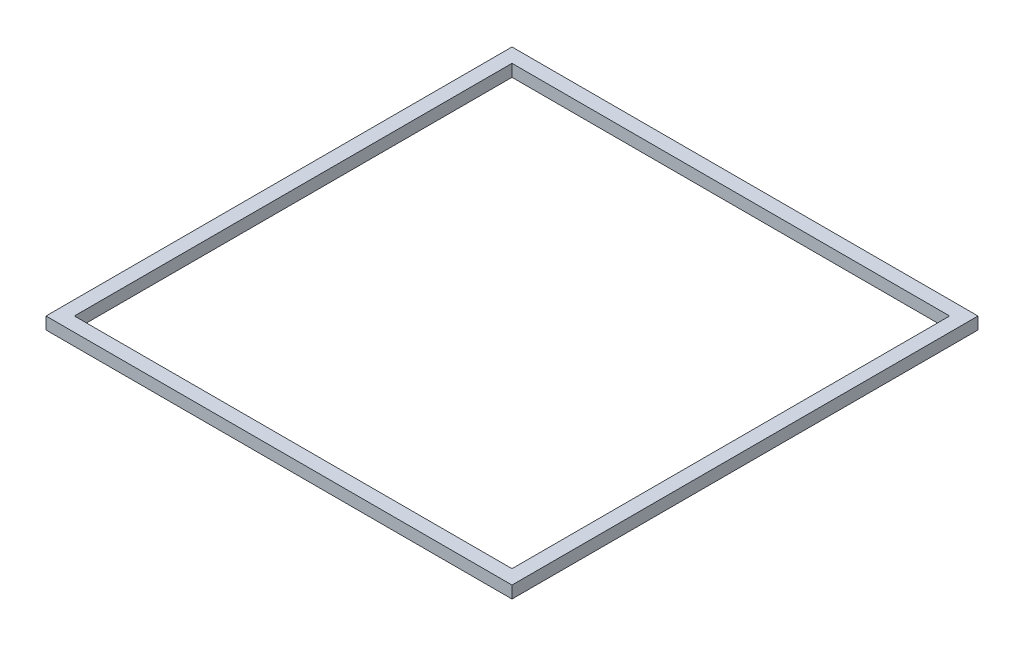
ISO-10303-21;
HEADER;
FILE_DESCRIPTION(('STEP AP214'),'2;1');
FILE_NAME('part.step','',(''),(''),'','','');
FILE_SCHEMA(('AUTOMOTIVE_DESIGN { 1 0 10303 214 1 1 1 1 }'));
ENDSEC;
DATA;
#1=APPLICATION_CONTEXT('core data for automotive mechanical design processes');
#2=APPLICATION_PROTOCOL_DEFINITION('international standard','automotive_design',2000,#1);
#3=PRODUCT_CONTEXT('',#1,'mechanical');
#4=PRODUCT('Part','Part','',(#3));
#5=PRODUCT_RELATED_PRODUCT_CATEGORY('part','',(#4));
#6=PRODUCT_DEFINITION_FORMATION('','',#4);
#7=PRODUCT_DEFINITION_CONTEXT('part definition',#1,'design');
#8=PRODUCT_DEFINITION('design','',#6,#7);
#9=PRODUCT_DEFINITION_SHAPE('','',#8);
#10=(LENGTH_UNIT() NAMED_UNIT(*) SI_UNIT(.MILLI.,.METRE.));
#11=(NAMED_UNIT(*) PLANE_ANGLE_UNIT() SI_UNIT($,.RADIAN.));
#12=(NAMED_UNIT(*) SI_UNIT($,.STERADIAN.) SOLID_ANGLE_UNIT());
#13=UNCERTAINTY_MEASURE_WITH_UNIT(LENGTH_MEASURE(1.E-05),#10,'distance_accuracy_value','');
#14=(GEOMETRIC_REPRESENTATION_CONTEXT(3) GLOBAL_UNCERTAINTY_ASSIGNED_CONTEXT((#13)) GLOBAL_UNIT_ASSIGNED_CONTEXT((#10,
#11,#12)) REPRESENTATION_CONTEXT('',''));
#15=CARTESIAN_POINT('',(0.,0.,0.));
#16=DIRECTION('',(0.,0.,1.));
#17=DIRECTION('',(1.,0.,0.));
#18=AXIS2_PLACEMENT_3D('',#15,#16,#17);
#19=CARTESIAN_POINT('',(0.,3.,0.));
#20=DIRECTION('',(0.,-1.,0.));
#21=DIRECTION('',(0.,0.,-1.));
#22=AXIS2_PLACEMENT_3D('',#19,#20,#21);
#23=PLANE('',#22);
#24=DIRECTION('',(0.,0.,-1.));
#25=VECTOR('',#24,1.);
#26=CARTESIAN_POINT('',(57.5,3.,57.5));
#27=LINE('',#26,#25);
#28=CARTESIAN_POINT('',(57.5,3.,57.5));
#29=VERTEX_POINT('',#28);
#30=CARTESIAN_POINT('',(57.5,3.,-57.5));
#31=VERTEX_POINT('',#30);
#32=EDGE_CURVE('E137',#29,#31,#27,.T.);
#33=ORIENTED_EDGE('',*,*,#32,.T.);
#34=DIRECTION('',(-1.,0.,0.));
#35=VECTOR('',#34,1.);
#36=CARTESIAN_POINT('',(-57.5,3.,-57.5));
#37=LINE('',#36,#35);
#38=CARTESIAN_POINT('',(-57.5,3.,-57.5));
#39=VERTEX_POINT('',#38);
#40=EDGE_CURVE('E140',#31,#39,#37,.T.);
#41=ORIENTED_EDGE('',*,*,#40,.T.);
#42=DIRECTION('',(0.,0.,1.));
#43=VECTOR('',#42,1.);
#44=CARTESIAN_POINT('',(-57.5,3.,57.5));
#45=LINE('',#44,#43);
#46=CARTESIAN_POINT('',(-57.5,3.,57.5));
#47=VERTEX_POINT('',#46);
#48=EDGE_CURVE('E143',#39,#47,#45,.T.);
#49=ORIENTED_EDGE('',*,*,#48,.T.);
#50=DIRECTION('',(1.,0.,0.));
#51=VECTOR('',#50,1.);
#52=CARTESIAN_POINT('',(-57.5,3.,57.5));
#53=LINE('',#52,#51);
#54=EDGE_CURVE('E145',#47,#29,#53,.T.);
#55=ORIENTED_EDGE('',*,*,#54,.T.);
#56=EDGE_LOOP('',(#33,#41,#49,#55));
#57=FACE_BOUND('',#56,.T.);
#58=DIRECTION('',(0.,0.,-1.));
#59=VECTOR('',#58,1.);
#60=CARTESIAN_POINT('',(54.,3.,54.));
#61=LINE('',#60,#59);
#62=CARTESIAN_POINT('',(54.,3.,54.));
#63=VERTEX_POINT('',#62);
#64=CARTESIAN_POINT('',(54.,3.,-54.));
#65=VERTEX_POINT('',#64);
#66=EDGE_CURVE('E101',#63,#65,#61,.T.);
#67=ORIENTED_EDGE('',*,*,#66,.F.);
#68=DIRECTION('',(1.,0.,0.));
#69=VECTOR('',#68,1.);
#70=CARTESIAN_POINT('',(-54.,3.,54.));
#71=LINE('',#70,#69);
#72=CARTESIAN_POINT('',(-54.,3.,54.));
#73=VERTEX_POINT('',#72);
#74=EDGE_CURVE('E123',#73,#63,#71,.T.);
#75=ORIENTED_EDGE('',*,*,#74,.F.);
#76=DIRECTION('',(0.,0.,1.));
#77=VECTOR('',#76,1.);
#78=CARTESIAN_POINT('',(-54.,3.,54.));
#79=LINE('',#78,#77);
#80=CARTESIAN_POINT('',(-54.,3.,-54.));
#81=VERTEX_POINT('',#80);
#82=EDGE_CURVE('E121',#81,#73,#79,.T.);
#83=ORIENTED_EDGE('',*,*,#82,.F.);
#84=DIRECTION('',(-1.,0.,0.));
#85=VECTOR('',#84,1.);
#86=CARTESIAN_POINT('',(-54.,3.,-54.));
#87=LINE('',#86,#85);
#88=EDGE_CURVE('E109',#65,#81,#87,.T.);
#89=ORIENTED_EDGE('',*,*,#88,.F.);
#90=EDGE_LOOP('',(#67,#75,#83,#89));
#91=FACE_BOUND('',#90,.T.);
#92=ADVANCED_FACE('F36',(#57,#91),#23,.F.);
#93=CARTESIAN_POINT('',(0.,0.,0.));
#94=DIRECTION('',(0.,-1.,0.));
#95=DIRECTION('',(0.,0.,-1.));
#96=AXIS2_PLACEMENT_3D('',#93,#94,#95);
#97=PLANE('',#96);
#98=DIRECTION('',(0.,0.,-1.));
#99=VECTOR('',#98,1.);
#100=CARTESIAN_POINT('',(57.5,0.,57.5));
#101=LINE('',#100,#99);
#102=CARTESIAN_POINT('',(57.5,0.,57.5));
#103=VERTEX_POINT('',#102);
#104=CARTESIAN_POINT('',(57.5,0.,-57.5));
#105=VERTEX_POINT('',#104);
#106=EDGE_CURVE('E117',#103,#105,#101,.T.);
#107=ORIENTED_EDGE('',*,*,#106,.F.);
#108=DIRECTION('',(1.,0.,0.));
#109=VECTOR('',#108,1.);
#110=CARTESIAN_POINT('',(-57.5,0.,57.5));
#111=LINE('',#110,#109);
#112=CARTESIAN_POINT('',(-57.5,0.,57.5));
#113=VERTEX_POINT('',#112);
#114=EDGE_CURVE('E141',#113,#103,#111,.T.);
#115=ORIENTED_EDGE('',*,*,#114,.F.);
#116=DIRECTION('',(0.,0.,1.));
#117=VECTOR('',#116,1.);
#118=CARTESIAN_POINT('',(-57.5,0.,57.5));
#119=LINE('',#118,#117);
#120=CARTESIAN_POINT('',(-57.5,0.,-57.5));
#121=VERTEX_POINT('',#120);
#122=EDGE_CURVE('E152',#121,#113,#119,.T.);
#123=ORIENTED_EDGE('',*,*,#122,.F.);
#124=DIRECTION('',(-1.,0.,0.));
#125=VECTOR('',#124,1.);
#126=CARTESIAN_POINT('',(-57.5,0.,-57.5));
#127=LINE('',#126,#125);
#128=EDGE_CURVE('E150',#105,#121,#127,.T.);
#129=ORIENTED_EDGE('',*,*,#128,.F.);
#130=EDGE_LOOP('',(#107,#115,#123,#129));
#131=FACE_BOUND('',#130,.T.);
#132=DIRECTION('',(1.,0.,0.));
#133=VECTOR('',#132,1.);
#134=CARTESIAN_POINT('',(-54.,0.,54.));
#135=LINE('',#134,#133);
#136=CARTESIAN_POINT('',(-54.,0.,54.));
#137=VERTEX_POINT('',#136);
#138=CARTESIAN_POINT('',(54.,0.,54.));
#139=VERTEX_POINT('',#138);
#140=EDGE_CURVE('E110',#137,#139,#135,.T.);
#141=ORIENTED_EDGE('',*,*,#140,.T.);
#142=DIRECTION('',(0.,0.,-1.));
#143=VECTOR('',#142,1.);
#144=CARTESIAN_POINT('',(54.,0.,54.));
#145=LINE('',#144,#143);
#146=CARTESIAN_POINT('',(54.,0.,-54.));
#147=VERTEX_POINT('',#146);
#148=EDGE_CURVE('E59',#139,#147,#145,.T.);
#149=ORIENTED_EDGE('',*,*,#148,.T.);
#150=DIRECTION('',(-1.,0.,0.));
#151=VECTOR('',#150,1.);
#152=CARTESIAN_POINT('',(-54.,0.,-54.));
#153=LINE('',#152,#151);
#154=CARTESIAN_POINT('',(-54.,0.,-54.));
#155=VERTEX_POINT('',#154);
#156=EDGE_CURVE('E116',#147,#155,#153,.T.);
#157=ORIENTED_EDGE('',*,*,#156,.T.);
#158=DIRECTION('',(0.,0.,1.));
#159=VECTOR('',#158,1.);
#160=CARTESIAN_POINT('',(-54.,0.,54.));
#161=LINE('',#160,#159);
#162=EDGE_CURVE('E129',#155,#137,#161,.T.);
#163=ORIENTED_EDGE('',*,*,#162,.T.);
#164=EDGE_LOOP('',(#141,#149,#157,#163));
#165=FACE_BOUND('',#164,.T.);
#166=ADVANCED_FACE('F170',(#131,#165),#97,.T.);
#167=CARTESIAN_POINT('',(57.5,3.,57.5));
#168=DIRECTION('',(-1.,0.,0.));
#169=DIRECTION('',(0.,0.,1.));
#170=AXIS2_PLACEMENT_3D('',#167,#168,#169);
#171=PLANE('',#170);
#172=ORIENTED_EDGE('',*,*,#106,.T.);
#173=DIRECTION('',(0.,-1.,0.));
#174=VECTOR('',#173,1.);
#175=CARTESIAN_POINT('',(57.5,3.,-57.5));
#176=LINE('',#175,#174);
#177=EDGE_CURVE('E11',#31,#105,#176,.T.);
#178=ORIENTED_EDGE('',*,*,#177,.F.);
#179=ORIENTED_EDGE('',*,*,#32,.F.);
#180=DIRECTION('',(0.,-1.,0.));
#181=VECTOR('',#180,1.);
#182=CARTESIAN_POINT('',(57.5,3.,57.5));
#183=LINE('',#182,#181);
#184=EDGE_CURVE('E147',#29,#103,#183,.T.);
#185=ORIENTED_EDGE('',*,*,#184,.T.);
#186=EDGE_LOOP('',(#172,#178,#179,#185));
#187=FACE_BOUND('',#186,.T.);
#188=ADVANCED_FACE('F38',(#187),#171,.F.);
#189=CARTESIAN_POINT('',(-57.5,3.,-57.5));
#190=DIRECTION('',(0.,0.,1.));
#191=DIRECTION('',(1.,0.,0.));
#192=AXIS2_PLACEMENT_3D('',#189,#190,#191);
#193=PLANE('',#192);
#194=ORIENTED_EDGE('',*,*,#128,.T.);
#195=DIRECTION('',(0.,-1.,0.));
#196=VECTOR('',#195,1.);
#197=CARTESIAN_POINT('',(-57.5,3.,-57.5));
#198=LINE('',#197,#196);
#199=EDGE_CURVE('E44',#39,#121,#198,.T.);
#200=ORIENTED_EDGE('',*,*,#199,.F.);
#201=ORIENTED_EDGE('',*,*,#40,.F.);
#202=ORIENTED_EDGE('',*,*,#177,.T.);
#203=EDGE_LOOP('',(#194,#200,#201,#202));
#204=FACE_BOUND('',#203,.T.);
#205=ADVANCED_FACE('F180',(#204),#193,.F.);
#206=CARTESIAN_POINT('',(-57.5,3.,57.5));
#207=DIRECTION('',(1.,0.,0.));
#208=DIRECTION('',(0.,0.,-1.));
#209=AXIS2_PLACEMENT_3D('',#206,#207,#208);
#210=PLANE('',#209);
#211=ORIENTED_EDGE('',*,*,#122,.T.);
#212=DIRECTION('',(0.,-1.,0.));
#213=VECTOR('',#212,1.);
#214=CARTESIAN_POINT('',(-57.5,3.,57.5));
#215=LINE('',#214,#213);
#216=EDGE_CURVE('E157',#47,#113,#215,.T.);
#217=ORIENTED_EDGE('',*,*,#216,.F.);
#218=ORIENTED_EDGE('',*,*,#48,.F.);
#219=ORIENTED_EDGE('',*,*,#199,.T.);
#220=EDGE_LOOP('',(#211,#217,#218,#219));
#221=FACE_BOUND('',#220,.T.);
#222=ADVANCED_FACE('F164',(#221),#210,.F.);
#223=CARTESIAN_POINT('',(-57.5,3.,57.5));
#224=DIRECTION('',(0.,0.,-1.));
#225=DIRECTION('',(-1.,0.,0.));
#226=AXIS2_PLACEMENT_3D('',#223,#224,#225);
#227=PLANE('',#226);
#228=ORIENTED_EDGE('',*,*,#114,.T.);
#229=ORIENTED_EDGE('',*,*,#184,.F.);
#230=ORIENTED_EDGE('',*,*,#54,.F.);
#231=ORIENTED_EDGE('',*,*,#216,.T.);
#232=EDGE_LOOP('',(#228,#229,#230,#231));
#233=FACE_BOUND('',#232,.T.);
#234=ADVANCED_FACE('F174',(#233),#227,.F.);
#235=CARTESIAN_POINT('',(54.,3.,54.));
#236=DIRECTION('',(-1.,0.,0.));
#237=DIRECTION('',(0.,0.,1.));
#238=AXIS2_PLACEMENT_3D('',#235,#236,#237);
#239=PLANE('',#238);
#240=ORIENTED_EDGE('',*,*,#148,.F.);
#241=DIRECTION('',(0.,-1.,0.));
#242=VECTOR('',#241,1.);
#243=CARTESIAN_POINT('',(54.,3.,54.));
#244=LINE('',#243,#242);
#245=EDGE_CURVE('E105',#63,#139,#244,.T.);
#246=ORIENTED_EDGE('',*,*,#245,.F.);
#247=ORIENTED_EDGE('',*,*,#66,.T.);
#248=DIRECTION('',(0.,-1.,0.));
#249=VECTOR('',#248,1.);
#250=CARTESIAN_POINT('',(54.,3.,-54.));
#251=LINE('',#250,#249);
#252=EDGE_CURVE('E104',#65,#147,#251,.T.);
#253=ORIENTED_EDGE('',*,*,#252,.T.);
#254=EDGE_LOOP('',(#240,#246,#247,#253));
#255=FACE_BOUND('',#254,.T.);
#256=ADVANCED_FACE('F103',(#255),#239,.T.);
#257=CARTESIAN_POINT('',(-54.,3.,-54.));
#258=DIRECTION('',(0.,0.,1.));
#259=DIRECTION('',(1.,0.,0.));
#260=AXIS2_PLACEMENT_3D('',#257,#258,#259);
#261=PLANE('',#260);
#262=ORIENTED_EDGE('',*,*,#156,.F.);
#263=ORIENTED_EDGE('',*,*,#252,.F.);
#264=ORIENTED_EDGE('',*,*,#88,.T.);
#265=DIRECTION('',(0.,-1.,0.));
#266=VECTOR('',#265,1.);
#267=CARTESIAN_POINT('',(-54.,3.,-54.));
#268=LINE('',#267,#266);
#269=EDGE_CURVE('E118',#81,#155,#268,.T.);
#270=ORIENTED_EDGE('',*,*,#269,.T.);
#271=EDGE_LOOP('',(#262,#263,#264,#270));
#272=FACE_BOUND('',#271,.T.);
#273=ADVANCED_FACE('F113',(#272),#261,.T.);
#274=CARTESIAN_POINT('',(-54.,3.,54.));
#275=DIRECTION('',(1.,0.,0.));
#276=DIRECTION('',(0.,0.,-1.));
#277=AXIS2_PLACEMENT_3D('',#274,#275,#276);
#278=PLANE('',#277);
#279=ORIENTED_EDGE('',*,*,#162,.F.);
#280=ORIENTED_EDGE('',*,*,#269,.F.);
#281=ORIENTED_EDGE('',*,*,#82,.T.);
#282=DIRECTION('',(0.,-1.,0.));
#283=VECTOR('',#282,1.);
#284=CARTESIAN_POINT('',(-54.,3.,54.));
#285=LINE('',#284,#283);
#286=EDGE_CURVE('E51',#73,#137,#285,.T.);
#287=ORIENTED_EDGE('',*,*,#286,.T.);
#288=EDGE_LOOP('',(#279,#280,#281,#287));
#289=FACE_BOUND('',#288,.T.);
#290=ADVANCED_FACE('F203',(#289),#278,.T.);
#291=CARTESIAN_POINT('',(-54.,3.,54.));
#292=DIRECTION('',(0.,0.,-1.));
#293=DIRECTION('',(-1.,0.,0.));
#294=AXIS2_PLACEMENT_3D('',#291,#292,#293);
#295=PLANE('',#294);
#296=ORIENTED_EDGE('',*,*,#140,.F.);
#297=ORIENTED_EDGE('',*,*,#286,.F.);
#298=ORIENTED_EDGE('',*,*,#74,.T.);
#299=ORIENTED_EDGE('',*,*,#245,.T.);
#300=EDGE_LOOP('',(#296,#297,#298,#299));
#301=FACE_BOUND('',#300,.T.);
#302=ADVANCED_FACE('F207',(#301),#295,.T.);
#303=CLOSED_SHELL('',(#92,#166,#188,#205,#222,#234,#256,#273,#290,#302));
#304=MANIFOLD_SOLID_BREP('B2',#303);
#305=ADVANCED_BREP_SHAPE_REPRESENTATION('',(#18,#304),#14);
#306=SHAPE_DEFINITION_REPRESENTATION(#9,#305);
ENDSEC;
END-ISO-10303-21;
